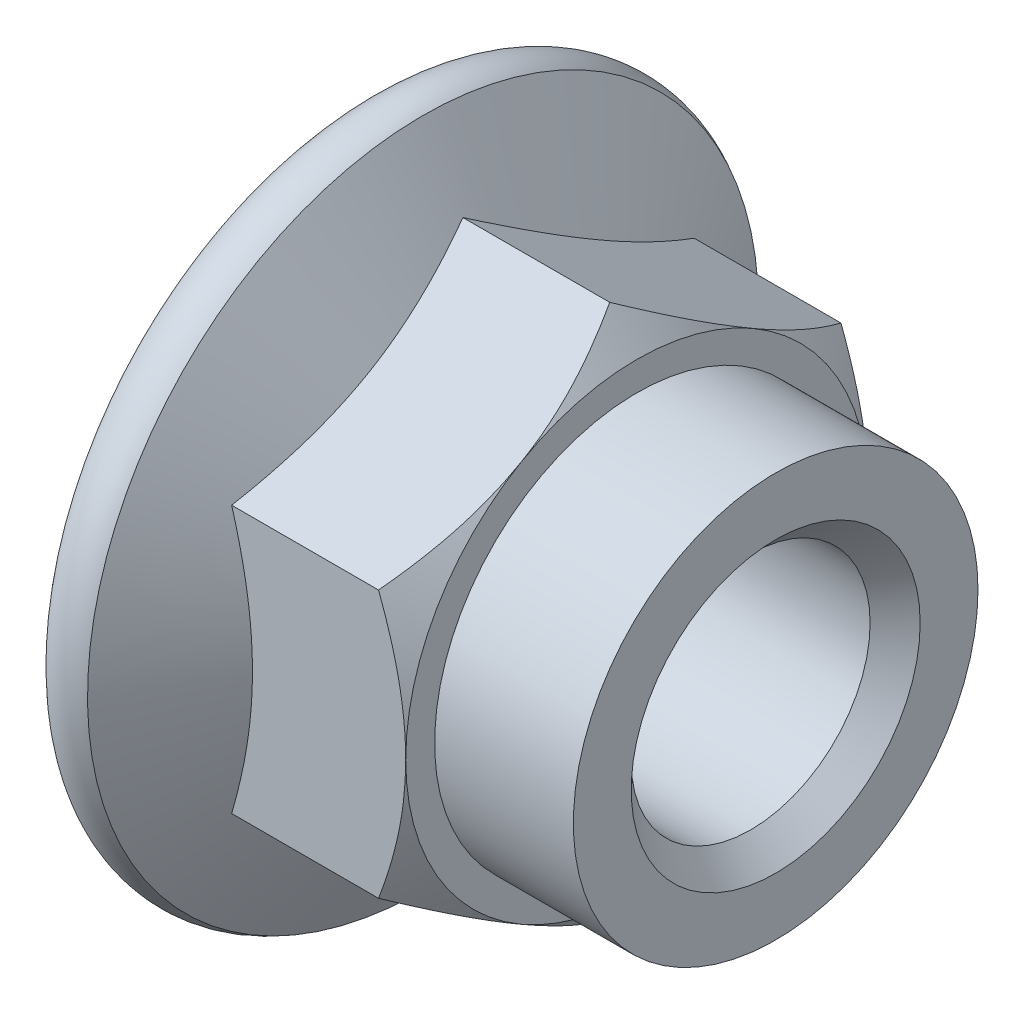
ISO-10303-21;
HEADER;
FILE_DESCRIPTION(('STEP AP214'),'2;1');
FILE_NAME('part.step','',(''),(''),'','','');
FILE_SCHEMA(('AUTOMOTIVE_DESIGN { 1 0 10303 214 1 1 1 1 }'));
ENDSEC;
DATA;
#1=APPLICATION_CONTEXT('core data for automotive mechanical design processes');
#2=APPLICATION_PROTOCOL_DEFINITION('international standard','automotive_design',2000,#1);
#3=PRODUCT_CONTEXT('',#1,'mechanical');
#4=PRODUCT('Part','Part','',(#3));
#5=PRODUCT_RELATED_PRODUCT_CATEGORY('part','',(#4));
#6=PRODUCT_DEFINITION_FORMATION('','',#4);
#7=PRODUCT_DEFINITION_CONTEXT('part definition',#1,'design');
#8=PRODUCT_DEFINITION('design','',#6,#7);
#9=PRODUCT_DEFINITION_SHAPE('','',#8);
#10=(LENGTH_UNIT() NAMED_UNIT(*) SI_UNIT(.MILLI.,.METRE.));
#11=(NAMED_UNIT(*) PLANE_ANGLE_UNIT() SI_UNIT($,.RADIAN.));
#12=(NAMED_UNIT(*) SI_UNIT($,.STERADIAN.) SOLID_ANGLE_UNIT());
#13=UNCERTAINTY_MEASURE_WITH_UNIT(LENGTH_MEASURE(1.E-05),#10,'distance_accuracy_value','');
#14=(GEOMETRIC_REPRESENTATION_CONTEXT(3) GLOBAL_UNCERTAINTY_ASSIGNED_CONTEXT((#13)) GLOBAL_UNIT_ASSIGNED_CONTEXT((#10,
#11,#12)) REPRESENTATION_CONTEXT('',''));
#15=CARTESIAN_POINT('',(0.,0.,0.));
#16=DIRECTION('',(0.,0.,1.));
#17=DIRECTION('',(1.,0.,0.));
#18=AXIS2_PLACEMENT_3D('',#15,#16,#17);
#19=CARTESIAN_POINT('',(7.1,0.,0.));
#20=DIRECTION('',(-1.,0.,0.));
#21=DIRECTION('',(0.,0.,-1.));
#22=AXIS2_PLACEMENT_3D('',#19,#20,#21);
#23=CYLINDRICAL_SURFACE('',#22,2.067);
#24=CARTESIAN_POINT('',(6.667,0.,0.));
#25=DIRECTION('',(1.,0.,0.));
#26=DIRECTION('',(0.,0.,-1.));
#27=AXIS2_PLACEMENT_3D('',#24,#25,#26);
#28=CIRCLE('',#27,2.067);
#29=CARTESIAN_POINT('',(6.667,0.,-2.067));
#30=VERTEX_POINT('',#29);
#31=EDGE_CURVE('E10',#30,#30,#28,.T.);
#32=ORIENTED_EDGE('',*,*,#31,.T.);
#33=EDGE_LOOP('',(#32));
#34=FACE_BOUND('',#33,.T.);
#35=CARTESIAN_POINT('',(0.433,0.,0.));
#36=DIRECTION('',(1.,0.,0.));
#37=DIRECTION('',(0.,0.,-1.));
#38=AXIS2_PLACEMENT_3D('',#35,#36,#37);
#39=CIRCLE('',#38,2.067);
#40=CARTESIAN_POINT('',(0.433,0.,-2.067));
#41=VERTEX_POINT('',#40);
#42=EDGE_CURVE('E419',#41,#41,#39,.T.);
#43=ORIENTED_EDGE('',*,*,#42,.F.);
#44=EDGE_LOOP('',(#43));
#45=FACE_BOUND('',#44,.T.);
#46=ADVANCED_FACE('F16',(#34,#45),#23,.F.);
#47=CARTESIAN_POINT('',(7.1,0.,0.));
#48=DIRECTION('',(-1.,0.,0.));
#49=DIRECTION('',(0.,0.,-1.));
#50=AXIS2_PLACEMENT_3D('',#47,#48,#49);
#51=CYLINDRICAL_SURFACE('',#50,3.5);
#52=CARTESIAN_POINT('',(7.1,0.,0.));
#53=DIRECTION('',(1.,0.,0.));
#54=DIRECTION('',(0.,0.,-1.));
#55=AXIS2_PLACEMENT_3D('',#52,#53,#54);
#56=CIRCLE('',#55,3.5);
#57=CARTESIAN_POINT('',(7.1,0.,-3.5));
#58=VERTEX_POINT('',#57);
#59=EDGE_CURVE('E155',#58,#58,#56,.T.);
#60=ORIENTED_EDGE('',*,*,#59,.F.);
#61=EDGE_LOOP('',(#60));
#62=FACE_BOUND('',#61,.T.);
#63=CARTESIAN_POINT('',(4.7,0.,0.));
#64=DIRECTION('',(1.,0.,0.));
#65=DIRECTION('',(0.,0.,-1.));
#66=AXIS2_PLACEMENT_3D('',#63,#64,#65);
#67=CIRCLE('',#66,3.5);
#68=CARTESIAN_POINT('',(4.7,0.,-3.5));
#69=VERTEX_POINT('',#68);
#70=EDGE_CURVE('E274',#69,#69,#67,.T.);
#71=ORIENTED_EDGE('',*,*,#70,.T.);
#72=EDGE_LOOP('',(#71));
#73=FACE_BOUND('',#72,.T.);
#74=ADVANCED_FACE('F335',(#62,#73),#51,.T.);
#75=CARTESIAN_POINT('',(4.23,0.,0.));
#76=DIRECTION('',(-1.,0.,0.));
#77=DIRECTION('',(0.,0.,1.));
#78=AXIS2_PLACEMENT_3D('',#75,#76,#77);
#79=CONICAL_SURFACE('',#78,4.61880215351701,0.921222635605643);
#80=CARTESIAN_POINT('',(4.7,0.,0.));
#81=DIRECTION('',(1.,0.,0.));
#82=DIRECTION('',(0.,0.,1.));
#83=AXIS2_PLACEMENT_3D('',#80,#81,#82);
#84=CIRCLE('',#83,4.);
#85=CARTESIAN_POINT('',(4.7,0.,-4.));
#86=VERTEX_POINT('',#85);
#87=CARTESIAN_POINT('',(4.7,3.46410161513775,-2.));
#88=VERTEX_POINT('',#87);
#89=EDGE_CURVE('E453',#86,#88,#84,.T.);
#90=ORIENTED_EDGE('',*,*,#89,.F.);
#91=CARTESIAN_POINT('',(4.23,2.30940107675851,-4.));
#92=CARTESIAN_POINT('',(4.4558503069235,1.71469190102773,-4.));
#93=CARTESIAN_POINT('',(4.57114716486447,1.17726879495852,-4.));
#94=CARTESIAN_POINT('',(4.7,0.576658404345635,-4.));
#95=CARTESIAN_POINT('',(4.7,0.,-4.));
#96=B_SPLINE_CURVE_WITH_KNOTS('',2,(#91,#92,#93,#94,#95),.UNSPECIFIED.,.F.,.F.,(3,2,3),(0.,0.5,
1.),.UNSPECIFIED.);
#97=CARTESIAN_POINT('',(4.23,2.30940107675851,-4.));
#98=VERTEX_POINT('',#97);
#99=EDGE_CURVE('E422',#98,#86,#96,.T.);
#100=ORIENTED_EDGE('',*,*,#99,.F.);
#101=CARTESIAN_POINT('',(4.70000000000006,3.46410161513775,-2.00000000000001));
#102=CARTESIAN_POINT('',(4.70000000000006,3.17722852047258,-2.49687877528459));
#103=CARTESIAN_POINT('',(4.57224588904825,2.87803411793331,-3.01509868182282));
#104=CARTESIAN_POINT('',(4.45713257885066,2.60844390426203,-3.48204262912484));
#105=CARTESIAN_POINT('',(4.23,2.3094010767585,-4.));
#106=B_SPLINE_CURVE_WITH_KNOTS('',2,(#101,#102,#103,#104,#105),.UNSPECIFIED.,.F.,.F.,(3,2,3),
(0.,0.5,1.),.UNSPECIFIED.);
#107=EDGE_CURVE('E167',#88,#98,#106,.T.);
#108=ORIENTED_EDGE('',*,*,#107,.F.);
#109=EDGE_LOOP('',(#90,#100,#108));
#110=FACE_BOUND('',#109,.T.);
#111=ADVANCED_FACE('F209',(#110),#79,.T.);
#112=CARTESIAN_POINT('',(4.23,0.,0.));
#113=DIRECTION('',(-1.,0.,0.));
#114=DIRECTION('',(0.,0.,1.));
#115=AXIS2_PLACEMENT_3D('',#112,#113,#114);
#116=CONICAL_SURFACE('',#115,4.61880215351701,0.921222635605643);
#117=CARTESIAN_POINT('',(4.7,0.,0.));
#118=DIRECTION('',(1.,0.,0.));
#119=DIRECTION('',(0.,0.,1.));
#120=AXIS2_PLACEMENT_3D('',#117,#118,#119);
#121=CIRCLE('',#120,4.);
#122=CARTESIAN_POINT('',(4.7,-3.46410161513775,-2.));
#123=VERTEX_POINT('',#122);
#124=EDGE_CURVE('E265',#123,#86,#121,.T.);
#125=ORIENTED_EDGE('',*,*,#124,.F.);
#126=CARTESIAN_POINT('',(4.23,-2.3094010767585,-4.));
#127=CARTESIAN_POINT('',(4.4558118857949,-2.60670507935345,-3.48505436221196));
#128=CARTESIAN_POINT('',(4.57110687940019,-2.87537329634029,-3.01970736001182));
#129=CARTESIAN_POINT('',(4.70000000000006,-3.17572879149731,-2.49947638206736));
#130=CARTESIAN_POINT('',(4.70000000000006,-3.46410161513776,-1.99999999999999));
#131=B_SPLINE_CURVE_WITH_KNOTS('',2,(#126,#127,#128,#129,#130),.UNSPECIFIED.,.F.,.F.,(3,2,3),
(0.,0.5,1.),.UNSPECIFIED.);
#132=CARTESIAN_POINT('',(4.23,-2.3094010767585,-4.));
#133=VERTEX_POINT('',#132);
#134=EDGE_CURVE('E283',#133,#123,#131,.T.);
#135=ORIENTED_EDGE('',*,*,#134,.F.);
#136=CARTESIAN_POINT('',(4.7,0.,-4.));
#137=CARTESIAN_POINT('',(4.7,-0.57345377885323,-4.));
#138=CARTESIAN_POINT('',(4.57237899445773,-1.17151165144553,-4.));
#139=CARTESIAN_POINT('',(4.45726130170289,-1.71097646865297,-4.));
#140=CARTESIAN_POINT('',(4.23,-2.30940107675852,-4.));
#141=B_SPLINE_CURVE_WITH_KNOTS('',2,(#136,#137,#138,#139,#140),.UNSPECIFIED.,.F.,.F.,(3,2,3),
(0.,0.5,1.),.UNSPECIFIED.);
#142=EDGE_CURVE('E29',#86,#133,#141,.T.);
#143=ORIENTED_EDGE('',*,*,#142,.F.);
#144=EDGE_LOOP('',(#125,#135,#143));
#145=FACE_BOUND('',#144,.T.);
#146=ADVANCED_FACE('F242',(#145),#116,.T.);
#147=CARTESIAN_POINT('',(4.23,0.,0.));
#148=DIRECTION('',(-1.,0.,0.));
#149=DIRECTION('',(0.,0.,1.));
#150=AXIS2_PLACEMENT_3D('',#147,#148,#149);
#151=CONICAL_SURFACE('',#150,4.61880215351701,0.921222635605643);
#152=CARTESIAN_POINT('',(4.7,0.,0.));
#153=DIRECTION('',(1.,0.,0.));
#154=DIRECTION('',(0.,0.,1.));
#155=AXIS2_PLACEMENT_3D('',#152,#153,#154);
#156=CIRCLE('',#155,4.);
#157=CARTESIAN_POINT('',(4.7,-3.46410161513775,2.));
#158=VERTEX_POINT('',#157);
#159=EDGE_CURVE('E256',#158,#123,#156,.T.);
#160=ORIENTED_EDGE('',*,*,#159,.F.);
#161=CARTESIAN_POINT('',(4.23,-4.618802153517,0.));
#162=CARTESIAN_POINT('',(4.45581188579266,-4.32149815092501,0.51494563778292));
#163=CARTESIAN_POINT('',(4.57110687940019,-4.05282993393522,0.980292639988176));
#164=CARTESIAN_POINT('',(4.70000000000006,-3.75247443878075,1.50052361792823));
#165=CARTESIAN_POINT('',(4.70000000000006,-3.46410161513775,2.00000000000001));
#166=B_SPLINE_CURVE_WITH_KNOTS('',2,(#161,#162,#163,#164,#165),.UNSPECIFIED.,.F.,.F.,(3,2,3),
(0.,0.5,1.),.UNSPECIFIED.);
#167=CARTESIAN_POINT('',(4.23,-4.61880215351701,0.));
#168=VERTEX_POINT('',#167);
#169=EDGE_CURVE('E273',#168,#158,#166,.T.);
#170=ORIENTED_EDGE('',*,*,#169,.F.);
#171=CARTESIAN_POINT('',(4.70000000000006,-3.46410161513776,-1.99999999999999));
#172=CARTESIAN_POINT('',(4.70000000000006,-3.75097470980291,-1.50312122471543));
#173=CARTESIAN_POINT('',(4.57224588904824,-4.0501691123422,-0.984901318177177));
#174=CARTESIAN_POINT('',(4.45713257885066,-4.31975932601349,-0.517957370875152));
#175=CARTESIAN_POINT('',(4.23,-4.61880215351701,0.));
#176=B_SPLINE_CURVE_WITH_KNOTS('',2,(#171,#172,#173,#174,#175),.UNSPECIFIED.,.F.,.F.,(3,2,3),
(0.,0.5,1.),.UNSPECIFIED.);
#177=EDGE_CURVE('E423',#123,#168,#176,.T.);
#178=ORIENTED_EDGE('',*,*,#177,.F.);
#179=EDGE_LOOP('',(#160,#170,#178));
#180=FACE_BOUND('',#179,.T.);
#181=ADVANCED_FACE('F232',(#180),#151,.T.);
#182=CARTESIAN_POINT('',(6.667,0.,0.));
#183=DIRECTION('',(1.,0.,0.));
#184=DIRECTION('',(0.,0.,-1.));
#185=AXIS2_PLACEMENT_3D('',#182,#183,#184);
#186=CONICAL_SURFACE('',#185,2.067,0.785398163397448);
#187=ORIENTED_EDGE('',*,*,#31,.F.);
#188=EDGE_LOOP('',(#187));
#189=FACE_BOUND('',#188,.T.);
#190=CARTESIAN_POINT('',(7.1,0.,0.));
#191=DIRECTION('',(1.,0.,0.));
#192=DIRECTION('',(0.,0.,-1.));
#193=AXIS2_PLACEMENT_3D('',#190,#191,#192);
#194=CIRCLE('',#193,2.5);
#195=CARTESIAN_POINT('',(7.1,0.,-2.5));
#196=VERTEX_POINT('',#195);
#197=EDGE_CURVE('E424',#196,#196,#194,.T.);
#198=ORIENTED_EDGE('',*,*,#197,.T.);
#199=EDGE_LOOP('',(#198));
#200=FACE_BOUND('',#199,.T.);
#201=ADVANCED_FACE('F241',(#189,#200),#186,.F.);
#202=CARTESIAN_POINT('',(7.1,-2.3094010767585,-4.));
#203=DIRECTION('',(0.,0.,1.));
#204=DIRECTION('',(1.,0.,0.));
#205=AXIS2_PLACEMENT_3D('',#202,#203,#204);
#206=PLANE('',#205);
#207=DIRECTION('',(-1.,0.,0.));
#208=VECTOR('',#207,1.);
#209=CARTESIAN_POINT('',(7.1,2.3094010767585,-4.));
#210=LINE('',#209,#208);
#211=CARTESIAN_POINT('',(1.68923142373829,2.3094010767585,-4.));
#212=VERTEX_POINT('',#211);
#213=EDGE_CURVE('E763',#98,#212,#210,.T.);
#214=ORIENTED_EDGE('',*,*,#213,.F.);
#215=ORIENTED_EDGE('',*,*,#99,.T.);
#216=ORIENTED_EDGE('',*,*,#142,.T.);
#217=DIRECTION('',(-1.,0.,0.));
#218=VECTOR('',#217,1.);
#219=CARTESIAN_POINT('',(7.1,-2.3094010767585,-4.));
#220=LINE('',#219,#218);
#221=CARTESIAN_POINT('',(1.68923142373887,-2.30940107675938,-4.));
#222=VERTEX_POINT('',#221);
#223=EDGE_CURVE('E764',#133,#222,#220,.T.);
#224=ORIENTED_EDGE('',*,*,#223,.T.);
#225=CARTESIAN_POINT('',(1.68923142373813,-2.30940107675909,-4.));
#226=CARTESIAN_POINT('',(1.86426724018693,-1.70711735384885,-4.));
#227=CARTESIAN_POINT('',(1.95256975549044,-1.16335093311594,-4.));
#228=CARTESIAN_POINT('',(2.04891186918304,-0.57007670815868,-4.));
#229=CARTESIAN_POINT('',(2.04890420590139,0.000642278675144509,-4.));
#230=CARTESIAN_POINT('',(2.04889650730377,0.573991405061045,-4.));
#231=CARTESIAN_POINT('',(1.95106676517824,1.17257660263544,-4.));
#232=CARTESIAN_POINT('',(1.86298051120727,1.71154488151685,-4.));
#233=CARTESIAN_POINT('',(1.68923142373829,2.3094010767585,-4.));
#234=B_SPLINE_CURVE_WITH_KNOTS('',2,(#225,#226,#227,#228,#229,#230,#231,#232,#233),
.UNSPECIFIED.,.F.,.F.,(3,2,2,2,3),(0.,0.25,0.5,0.75,1.),.UNSPECIFIED.);
#235=EDGE_CURVE('E430',#222,#212,#234,.T.);
#236=ORIENTED_EDGE('',*,*,#235,.T.);
#237=EDGE_LOOP('',(#214,#215,#216,#224,#236));
#238=FACE_BOUND('',#237,.T.);
#239=ADVANCED_FACE('F244',(#238),#206,.F.);
#240=CARTESIAN_POINT('',(0.,0.,0.));
#241=DIRECTION('',(-1.,0.,0.));
#242=DIRECTION('',(0.,0.,1.));
#243=AXIS2_PLACEMENT_3D('',#240,#241,#242);
#244=CONICAL_SURFACE('',#243,2.5,0.785398163397448);
#245=ORIENTED_EDGE('',*,*,#42,.T.);
#246=EDGE_LOOP('',(#245));
#247=FACE_BOUND('',#246,.T.);
#248=CARTESIAN_POINT('',(0.,0.,0.));
#249=DIRECTION('',(1.,0.,0.));
#250=DIRECTION('',(0.,0.,-1.));
#251=AXIS2_PLACEMENT_3D('',#248,#249,#250);
#252=CIRCLE('',#251,2.5);
#253=CARTESIAN_POINT('',(0.,0.,-2.5));
#254=VERTEX_POINT('',#253);
#255=EDGE_CURVE('E404',#254,#254,#252,.T.);
#256=ORIENTED_EDGE('',*,*,#255,.F.);
#257=EDGE_LOOP('',(#256));
#258=FACE_BOUND('',#257,.T.);
#259=ADVANCED_FACE('F536',(#247,#258),#244,.F.);
#260=CARTESIAN_POINT('',(4.23,0.,0.));
#261=DIRECTION('',(-1.,0.,0.));
#262=DIRECTION('',(0.,0.,1.));
#263=AXIS2_PLACEMENT_3D('',#260,#261,#262);
#264=CONICAL_SURFACE('',#263,4.61880215351701,0.921222635605643);
#265=CARTESIAN_POINT('',(4.7,0.,0.));
#266=DIRECTION('',(1.,0.,0.));
#267=DIRECTION('',(0.,0.,1.));
#268=AXIS2_PLACEMENT_3D('',#265,#266,#267);
#269=CIRCLE('',#268,4.);
#270=CARTESIAN_POINT('',(4.7,0.,4.));
#271=VERTEX_POINT('',#270);
#272=EDGE_CURVE('E266',#271,#158,#269,.T.);
#273=ORIENTED_EDGE('',*,*,#272,.F.);
#274=CARTESIAN_POINT('',(4.23,-2.30940107675852,4.));
#275=CARTESIAN_POINT('',(4.45703911648286,-1.71156152691948,4.));
#276=CARTESIAN_POINT('',(4.57237899445772,-1.17151165144553,4.));
#277=CARTESIAN_POINT('',(4.7,-0.57395849497355,4.));
#278=CARTESIAN_POINT('',(4.7,0.,4.));
#279=B_SPLINE_CURVE_WITH_KNOTS('',2,(#274,#275,#276,#277,#278),.UNSPECIFIED.,.F.,.F.,(3,2,3),
(0.,0.5,1.),.UNSPECIFIED.);
#280=CARTESIAN_POINT('',(4.23,-2.30940107675851,4.));
#281=VERTEX_POINT('',#280);
#282=EDGE_CURVE('E189',#281,#271,#279,.T.);
#283=ORIENTED_EDGE('',*,*,#282,.F.);
#284=CARTESIAN_POINT('',(4.70000000000006,-3.46410161513775,2.00000000000001));
#285=CARTESIAN_POINT('',(4.70000000000006,-3.17722852047258,2.49687877528459));
#286=CARTESIAN_POINT('',(4.57224588904825,-2.87803411793331,3.01509868182282));
#287=CARTESIAN_POINT('',(4.45713257885066,-2.60844390426203,3.48204262912484));
#288=CARTESIAN_POINT('',(4.23,-2.3094010767585,4.));
#289=B_SPLINE_CURVE_WITH_KNOTS('',2,(#284,#285,#286,#287,#288),.UNSPECIFIED.,.F.,.F.,(3,2,3),
(0.,0.5,1.),.UNSPECIFIED.);
#290=EDGE_CURVE('E744',#158,#281,#289,.T.);
#291=ORIENTED_EDGE('',*,*,#290,.F.);
#292=EDGE_LOOP('',(#273,#283,#291));
#293=FACE_BOUND('',#292,.T.);
#294=ADVANCED_FACE('F337',(#293),#264,.T.);
#295=CARTESIAN_POINT('',(0.654669810022327,0.,0.));
#296=DIRECTION('',(1.,0.,0.));
#297=DIRECTION('',(0.,0.,-1.));
#298=AXIS2_PLACEMENT_3D('',#295,#296,#297);
#299=TOROIDAL_SURFACE('',#298,5.22730741769586,0.672692582304139);
#300=CARTESIAN_POINT('',(0.654669810022327,0.,-5.9));
#301=VERTEX_POINT('',#300);
#302=VERTEX_LOOP('',#301);
#303=FACE_BOUND('',#302,.T.);
#304=CARTESIAN_POINT('',(0.,0.,0.));
#305=DIRECTION('',(1.,0.,0.));
#306=DIRECTION('',(0.,0.,-1.));
#307=AXIS2_PLACEMENT_3D('',#304,#305,#306);
#308=CIRCLE('',#307,5.38197722771818);
#309=CARTESIAN_POINT('',(0.,0.,-5.38197722771818));
#310=VERTEX_POINT('',#309);
#311=EDGE_CURVE('E409',#310,#310,#308,.T.);
#312=ORIENTED_EDGE('',*,*,#311,.T.);
#313=EDGE_LOOP('',(#312));
#314=FACE_BOUND('',#313,.T.);
#315=CARTESIAN_POINT('',(1.,0.,0.));
#316=DIRECTION('',(1.,0.,0.));
#317=DIRECTION('',(0.,0.,-1.));
#318=AXIS2_PLACEMENT_3D('',#315,#316,#317);
#319=CIRCLE('',#318,5.80459622771819);
#320=CARTESIAN_POINT('',(1.,0.,-5.80459622771819));
#321=VERTEX_POINT('',#320);
#322=EDGE_CURVE('E428',#321,#321,#319,.T.);
#323=ORIENTED_EDGE('',*,*,#322,.F.);
#324=EDGE_LOOP('',(#323));
#325=FACE_BOUND('',#324,.T.);
#326=ADVANCED_FACE('F474',(#303,#314,#325),#299,.T.);
#327=CARTESIAN_POINT('',(4.23,0.,0.));
#328=DIRECTION('',(-1.,0.,0.));
#329=DIRECTION('',(0.,0.,1.));
#330=AXIS2_PLACEMENT_3D('',#327,#328,#329);
#331=CONICAL_SURFACE('',#330,4.61880215351701,0.921222635605643);
#332=CARTESIAN_POINT('',(4.7,0.,4.));
#333=CARTESIAN_POINT('',(4.7,0.57616193221549,4.));
#334=CARTESIAN_POINT('',(4.57114716486447,1.17726879495852,4.));
#335=CARTESIAN_POINT('',(4.45606894391298,1.71411618596419,4.));
#336=CARTESIAN_POINT('',(4.23,2.3094010767585,4.));
#337=B_SPLINE_CURVE_WITH_KNOTS('',2,(#332,#333,#334,#335,#336),.UNSPECIFIED.,.F.,.F.,(3,2,3),
(0.,0.5,1.),.UNSPECIFIED.);
#338=CARTESIAN_POINT('',(4.23,2.3094010767585,4.));
#339=VERTEX_POINT('',#338);
#340=EDGE_CURVE('E129',#271,#339,#337,.T.);
#341=ORIENTED_EDGE('',*,*,#340,.F.);
#342=CARTESIAN_POINT('',(4.7,0.,0.));
#343=DIRECTION('',(1.,0.,0.));
#344=DIRECTION('',(0.,0.,1.));
#345=AXIS2_PLACEMENT_3D('',#342,#343,#344);
#346=CIRCLE('',#345,4.);
#347=CARTESIAN_POINT('',(4.7,3.46410161513775,2.));
#348=VERTEX_POINT('',#347);
#349=EDGE_CURVE('E427',#348,#271,#346,.T.);
#350=ORIENTED_EDGE('',*,*,#349,.F.);
#351=CARTESIAN_POINT('',(4.23,2.3094010767585,4.));
#352=CARTESIAN_POINT('',(4.45581188579143,2.60670507934889,3.48505436221987));
#353=CARTESIAN_POINT('',(4.57110687940019,2.87537329634029,3.01970736001182));
#354=CARTESIAN_POINT('',(4.70000000000006,3.17572879149336,2.4994763820742));
#355=CARTESIAN_POINT('',(4.70000000000006,3.46410161513776,1.99999999999999));
#356=B_SPLINE_CURVE_WITH_KNOTS('',2,(#351,#352,#353,#354,#355),.UNSPECIFIED.,.F.,.F.,(3,2,3),
(0.,0.5,1.),.UNSPECIFIED.);
#357=EDGE_CURVE('E172',#339,#348,#356,.T.);
#358=ORIENTED_EDGE('',*,*,#357,.F.);
#359=EDGE_LOOP('',(#341,#350,#358));
#360=FACE_BOUND('',#359,.T.);
#361=ADVANCED_FACE('F297',(#360),#331,.T.);
#362=CARTESIAN_POINT('',(7.1,-4.61880215351701,0.));
#363=DIRECTION('',(0.,0.866025403784439,0.5));
#364=DIRECTION('',(1.,0.,0.));
#365=AXIS2_PLACEMENT_3D('',#362,#363,#364);
#366=PLANE('',#365);
#367=ORIENTED_EDGE('',*,*,#223,.F.);
#368=ORIENTED_EDGE('',*,*,#134,.T.);
#369=ORIENTED_EDGE('',*,*,#177,.T.);
#370=DIRECTION('',(-1.,0.,0.));
#371=VECTOR('',#370,1.);
#372=CARTESIAN_POINT('',(7.1,-4.61880215351701,0.));
#373=LINE('',#372,#371);
#374=CARTESIAN_POINT('',(1.68923142373829,-4.61880215351701,0.));
#375=VERTEX_POINT('',#374);
#376=EDGE_CURVE('E269',#168,#375,#373,.T.);
#377=ORIENTED_EDGE('',*,*,#376,.T.);
#378=CARTESIAN_POINT('',(1.68923142373919,-4.61880215351707,1.09659861194194E-13));
#379=CARTESIAN_POINT('',(2.0481172127533,-4.00135404063251,-1.06945150255347));
#380=CARTESIAN_POINT('',(2.04890274954237,-3.46636310639295,-1.99608298224514));
#381=CARTESIAN_POINT('',(2.04932328015646,-3.17996014062287,-2.49214747039733));
#382=CARTESIAN_POINT('',(1.95214357685184,-2.8811147455525,-3.0097628782672));
#383=CARTESIAN_POINT('',(1.86401924186759,-2.61011626739154,-3.47914601121582));
#384=CARTESIAN_POINT('',(1.68923142373889,-2.30940107675872,-3.99999999999962));
#385=B_SPLINE_CURVE_WITH_KNOTS('',2,(#378,#379,#380,#381,#382,#383,#384),.UNSPECIFIED.,.F.,.F.,
(3,2,2,3),(0.,0.5,0.75,1.),.UNSPECIFIED.);
#386=EDGE_CURVE('E319',#375,#222,#385,.T.);
#387=ORIENTED_EDGE('',*,*,#386,.T.);
#388=EDGE_LOOP('',(#367,#368,#369,#377,#387));
#389=FACE_BOUND('',#388,.T.);
#390=ADVANCED_FACE('F206',(#389),#366,.F.);
#391=CARTESIAN_POINT('',(7.1,2.3094010767585,4.));
#392=DIRECTION('',(0.,0.,-1.));
#393=DIRECTION('',(0.,-1.,0.));
#394=AXIS2_PLACEMENT_3D('',#391,#392,#393);
#395=PLANE('',#394);
#396=DIRECTION('',(-1.,0.,0.));
#397=VECTOR('',#396,1.);
#398=CARTESIAN_POINT('',(7.1,-2.3094010767585,4.));
#399=LINE('',#398,#397);
#400=CARTESIAN_POINT('',(1.68923142373829,-2.3094010767585,4.));
#401=VERTEX_POINT('',#400);
#402=EDGE_CURVE('E745',#281,#401,#399,.T.);
#403=ORIENTED_EDGE('',*,*,#402,.F.);
#404=ORIENTED_EDGE('',*,*,#282,.T.);
#405=ORIENTED_EDGE('',*,*,#340,.T.);
#406=DIRECTION('',(-1.,0.,0.));
#407=VECTOR('',#406,1.);
#408=CARTESIAN_POINT('',(7.1,2.3094010767585,4.));
#409=LINE('',#408,#407);
#410=CARTESIAN_POINT('',(1.68923142373829,2.3094010767585,4.));
#411=VERTEX_POINT('',#410);
#412=EDGE_CURVE('E163',#339,#411,#409,.T.);
#413=ORIENTED_EDGE('',*,*,#412,.T.);
#414=CARTESIAN_POINT('',(1.68923142373829,2.3094010767585,4.));
#415=CARTESIAN_POINT('',(1.86280798033672,1.71213854592869,4.));
#416=CARTESIAN_POINT('',(1.95106676517823,1.17257660263558,4.));
#417=CARTESIAN_POINT('',(2.0488034595324,0.575072333440355,4.));
#418=CARTESIAN_POINT('',(2.0489042059014,0.00064227867544505,4.));
#419=CARTESIAN_POINT('',(2.04900411227549,-0.568998339777225,4.));
#420=CARTESIAN_POINT('',(1.95256975549052,-1.16335093311549,4.));
#421=CARTESIAN_POINT('',(1.8644388927565,-1.70652671159762,4.));
#422=CARTESIAN_POINT('',(1.6892314237383,-2.30940107675851,4.));
#423=B_SPLINE_CURVE_WITH_KNOTS('',2,(#414,#415,#416,#417,#418,#419,#420,#421,#422),
.UNSPECIFIED.,.F.,.F.,(3,2,2,2,3),(0.,0.25,0.5,0.75,1.),.UNSPECIFIED.);
#424=EDGE_CURVE('E139',#411,#401,#423,.T.);
#425=ORIENTED_EDGE('',*,*,#424,.T.);
#426=EDGE_LOOP('',(#403,#404,#405,#413,#425));
#427=FACE_BOUND('',#426,.T.);
#428=ADVANCED_FACE('F170',(#427),#395,.F.);
#429=CARTESIAN_POINT('',(7.1,-2.3094010767585,4.));
#430=DIRECTION('',(0.,0.866025403784439,-0.5));
#431=DIRECTION('',(-1.,0.,0.));
#432=AXIS2_PLACEMENT_3D('',#429,#430,#431);
#433=PLANE('',#432);
#434=ORIENTED_EDGE('',*,*,#376,.F.);
#435=ORIENTED_EDGE('',*,*,#169,.T.);
#436=ORIENTED_EDGE('',*,*,#290,.T.);
#437=ORIENTED_EDGE('',*,*,#402,.T.);
#438=CARTESIAN_POINT('',(1.68923142373919,-2.30940107675844,4.00000000000011));
#439=CARTESIAN_POINT('',(2.04811721275148,-2.92684918963985,2.93054849745198));
#440=CARTESIAN_POINT('',(2.04890274954237,-3.46184012388269,2.00391701775463));
#441=CARTESIAN_POINT('',(2.04932328015743,-3.74824308965003,1.5078525296072));
#442=CARTESIAN_POINT('',(1.95214357685178,-4.0470884847232,0.990237121732471));
#443=CARTESIAN_POINT('',(1.86401924186729,-4.31808696288453,0.520853988783203));
#444=CARTESIAN_POINT('',(1.68923142373874,-4.61880215351704,0.));
#445=B_SPLINE_CURVE_WITH_KNOTS('',2,(#438,#439,#440,#441,#442,#443,#444),.UNSPECIFIED.,.F.,.F.,
(3,2,2,3),(0.,0.5,0.75,1.),.UNSPECIFIED.);
#446=EDGE_CURVE('E150',#401,#375,#445,.T.);
#447=ORIENTED_EDGE('',*,*,#446,.T.);
#448=EDGE_LOOP('',(#434,#435,#436,#437,#447));
#449=FACE_BOUND('',#448,.T.);
#450=ADVANCED_FACE('F205',(#449),#433,.F.);
#451=CARTESIAN_POINT('',(4.7,4.61880215351701,0.));
#452=DIRECTION('',(-1.,0.,0.));
#453=DIRECTION('',(0.,0.,1.));
#454=AXIS2_PLACEMENT_3D('',#451,#452,#453);
#455=PLANE('',#454);
#456=ORIENTED_EDGE('',*,*,#70,.F.);
#457=EDGE_LOOP('',(#456));
#458=FACE_BOUND('',#457,.T.);
#459=ORIENTED_EDGE('',*,*,#349,.T.);
#460=ORIENTED_EDGE('',*,*,#272,.T.);
#461=ORIENTED_EDGE('',*,*,#159,.T.);
#462=ORIENTED_EDGE('',*,*,#124,.T.);
#463=ORIENTED_EDGE('',*,*,#89,.T.);
#464=CARTESIAN_POINT('',(4.7,0.,0.));
#465=DIRECTION('',(1.,0.,0.));
#466=DIRECTION('',(0.,0.,1.));
#467=AXIS2_PLACEMENT_3D('',#464,#465,#466);
#468=CIRCLE('',#467,4.);
#469=EDGE_CURVE('E181',#88,#348,#468,.T.);
#470=ORIENTED_EDGE('',*,*,#469,.T.);
#471=EDGE_LOOP('',(#459,#460,#461,#462,#463,#470));
#472=FACE_BOUND('',#471,.T.);
#473=ADVANCED_FACE('F590',(#458,#472),#455,.F.);
#474=CARTESIAN_POINT('',(7.1,4.61880215351701,0.));
#475=DIRECTION('',(-1.,0.,0.));
#476=DIRECTION('',(0.,1.,0.));
#477=AXIS2_PLACEMENT_3D('',#474,#475,#476);
#478=PLANE('',#477);
#479=ORIENTED_EDGE('',*,*,#197,.F.);
#480=EDGE_LOOP('',(#479));
#481=FACE_BOUND('',#480,.T.);
#482=ORIENTED_EDGE('',*,*,#59,.T.);
#483=EDGE_LOOP('',(#482));
#484=FACE_BOUND('',#483,.T.);
#485=ADVANCED_FACE('F334',(#481,#484),#478,.F.);
#486=CARTESIAN_POINT('',(2.33952443660349,0.,0.));
#487=DIRECTION('',(-1.,0.,0.));
#488=DIRECTION('',(0.,0.,1.));
#489=AXIS2_PLACEMENT_3D('',#486,#487,#488);
#490=CONICAL_SURFACE('',#489,3.5,1.04428486659339);
#491=CARTESIAN_POINT('',(1.68923142373919,4.61880215351707,-1.0965926190184E-13));
#492=CARTESIAN_POINT('',(2.0481172127533,4.00135404063252,1.06945150255345));
#493=CARTESIAN_POINT('',(2.04890274954237,3.46636310639282,1.99608298224537));
#494=CARTESIAN_POINT('',(2.04932328015646,3.17996014062236,2.4921474703982));
#495=CARTESIAN_POINT('',(1.95214357685178,2.88111474555231,3.00976287826753));
#496=CARTESIAN_POINT('',(1.8640192418672,2.61011626739083,3.47914601121706));
#497=CARTESIAN_POINT('',(1.68923142373874,2.30940107675847,4.00000000000006));
#498=B_SPLINE_CURVE_WITH_KNOTS('',2,(#491,#492,#493,#494,#495,#496,#497),.UNSPECIFIED.,.F.,.F.,
(3,2,2,3),(0.,0.5,0.75,1.),.UNSPECIFIED.);
#499=CARTESIAN_POINT('',(1.68923142373829,4.61880215351701,0.));
#500=VERTEX_POINT('',#499);
#501=EDGE_CURVE('E145',#500,#411,#498,.T.);
#502=ORIENTED_EDGE('',*,*,#501,.F.);
#503=CARTESIAN_POINT('',(1.68923142373919,2.30940107675844,-4.00000000000011));
#504=CARTESIAN_POINT('',(2.04811721275148,2.92684918963985,-2.93054849745198));
#505=CARTESIAN_POINT('',(2.04890274954237,3.46184012388269,-2.00391701775463));
#506=CARTESIAN_POINT('',(2.04932328015743,3.74824308965003,-1.5078525296072));
#507=CARTESIAN_POINT('',(1.95214357685178,4.0470884847232,-0.990237121732471));
#508=CARTESIAN_POINT('',(1.86401924186729,4.31808696288453,-0.520853988783203));
#509=CARTESIAN_POINT('',(1.68923142373874,4.61880215351704,0.));
#510=B_SPLINE_CURVE_WITH_KNOTS('',2,(#503,#504,#505,#506,#507,#508,#509),.UNSPECIFIED.,.F.,.F.,
(3,2,2,3),(0.,0.5,0.75,1.),.UNSPECIFIED.);
#511=EDGE_CURVE('E431',#212,#500,#510,.T.);
#512=ORIENTED_EDGE('',*,*,#511,.F.);
#513=ORIENTED_EDGE('',*,*,#235,.F.);
#514=ORIENTED_EDGE('',*,*,#386,.F.);
#515=ORIENTED_EDGE('',*,*,#446,.F.);
#516=ORIENTED_EDGE('',*,*,#424,.F.);
#517=EDGE_LOOP('',(#502,#512,#513,#514,#515,#516));
#518=FACE_BOUND('',#517,.T.);
#519=ORIENTED_EDGE('',*,*,#322,.T.);
#520=EDGE_LOOP('',(#519));
#521=FACE_BOUND('',#520,.T.);
#522=ADVANCED_FACE('F142',(#518,#521),#490,.T.);
#523=CARTESIAN_POINT('',(7.1,2.3094010767585,-4.));
#524=DIRECTION('',(0.,-0.866025403784439,0.5));
#525=DIRECTION('',(-1.,0.,0.));
#526=AXIS2_PLACEMENT_3D('',#523,#524,#525);
#527=PLANE('',#526);
#528=DIRECTION('',(-1.,0.,0.));
#529=VECTOR('',#528,1.);
#530=CARTESIAN_POINT('',(7.1,4.61880215351701,0.));
#531=LINE('',#530,#529);
#532=CARTESIAN_POINT('',(4.23,4.61880215351701,0.));
#533=VERTEX_POINT('',#532);
#534=EDGE_CURVE('E165',#533,#500,#531,.T.);
#535=ORIENTED_EDGE('',*,*,#534,.F.);
#536=CARTESIAN_POINT('',(4.23,4.618802153517,0.));
#537=CARTESIAN_POINT('',(4.45581188579346,4.32149815092396,-0.514945637784743));
#538=CARTESIAN_POINT('',(4.57110687940019,4.05282993393522,-0.980292639988176));
#539=CARTESIAN_POINT('',(4.70000000000006,3.75247443877985,-1.50052361792979));
#540=CARTESIAN_POINT('',(4.70000000000006,3.46410161513775,-2.00000000000001));
#541=B_SPLINE_CURVE_WITH_KNOTS('',2,(#536,#537,#538,#539,#540),.UNSPECIFIED.,.F.,.F.,(3,2,3),
(0.,0.5,1.),.UNSPECIFIED.);
#542=EDGE_CURVE('E173',#533,#88,#541,.T.);
#543=ORIENTED_EDGE('',*,*,#542,.T.);
#544=ORIENTED_EDGE('',*,*,#107,.T.);
#545=ORIENTED_EDGE('',*,*,#213,.T.);
#546=ORIENTED_EDGE('',*,*,#511,.T.);
#547=EDGE_LOOP('',(#535,#543,#544,#545,#546));
#548=FACE_BOUND('',#547,.T.);
#549=ADVANCED_FACE('F18',(#548),#527,.F.);
#550=CARTESIAN_POINT('',(7.1,4.61880215351701,0.));
#551=DIRECTION('',(0.,-0.866025403784439,-0.5));
#552=DIRECTION('',(0.,0.5,-0.866025403784439));
#553=AXIS2_PLACEMENT_3D('',#550,#551,#552);
#554=PLANE('',#553);
#555=ORIENTED_EDGE('',*,*,#412,.F.);
#556=ORIENTED_EDGE('',*,*,#357,.T.);
#557=CARTESIAN_POINT('',(4.70000000000006,3.46410161513776,1.99999999999999));
#558=CARTESIAN_POINT('',(4.70000000000006,3.75097470980299,1.50312122471531));
#559=CARTESIAN_POINT('',(4.57224588904824,4.0501691123422,0.984901318177177));
#560=CARTESIAN_POINT('',(4.45713257885061,4.31975932601355,0.517957370875055));
#561=CARTESIAN_POINT('',(4.23,4.61880215351701,0.));
#562=B_SPLINE_CURVE_WITH_KNOTS('',2,(#557,#558,#559,#560,#561),.UNSPECIFIED.,.F.,.F.,(3,2,3),
(0.,0.5,1.),.UNSPECIFIED.);
#563=EDGE_CURVE('E395',#348,#533,#562,.T.);
#564=ORIENTED_EDGE('',*,*,#563,.T.);
#565=ORIENTED_EDGE('',*,*,#534,.T.);
#566=ORIENTED_EDGE('',*,*,#501,.T.);
#567=EDGE_LOOP('',(#555,#556,#564,#565,#566));
#568=FACE_BOUND('',#567,.T.);
#569=ADVANCED_FACE('F161',(#568),#554,.F.);
#570=CARTESIAN_POINT('',(4.23,0.,0.));
#571=DIRECTION('',(-1.,0.,0.));
#572=DIRECTION('',(0.,0.,1.));
#573=AXIS2_PLACEMENT_3D('',#570,#571,#572);
#574=CONICAL_SURFACE('',#573,4.61880215351701,0.921222635605643);
#575=ORIENTED_EDGE('',*,*,#563,.F.);
#576=ORIENTED_EDGE('',*,*,#469,.F.);
#577=ORIENTED_EDGE('',*,*,#542,.F.);
#578=EDGE_LOOP('',(#575,#576,#577));
#579=FACE_BOUND('',#578,.T.);
#580=ADVANCED_FACE('F247',(#579),#574,.T.);
#581=CARTESIAN_POINT('',(0.,0.,0.));
#582=DIRECTION('',(1.,0.,0.));
#583=DIRECTION('',(0.,1.,0.));
#584=AXIS2_PLACEMENT_3D('',#581,#582,#583);
#585=PLANE('',#584);
#586=ORIENTED_EDGE('',*,*,#255,.T.);
#587=EDGE_LOOP('',(#586));
#588=FACE_BOUND('',#587,.T.);
#589=ORIENTED_EDGE('',*,*,#311,.F.);
#590=EDGE_LOOP('',(#589));
#591=FACE_BOUND('',#590,.T.);
#592=ADVANCED_FACE('F520',(#588,#591),#585,.F.);
#593=CLOSED_SHELL('',(#46,#74,#111,#146,#181,#201,#239,#259,#294,#326,#361,#390,#428,#450,#473,
#485,#522,#549,#569,#580,#592));
#594=MANIFOLD_SOLID_BREP('B1',#593);
#595=ADVANCED_BREP_SHAPE_REPRESENTATION('',(#18,#594),#14);
#596=SHAPE_DEFINITION_REPRESENTATION(#9,#595);
ENDSEC;
END-ISO-10303-21;
